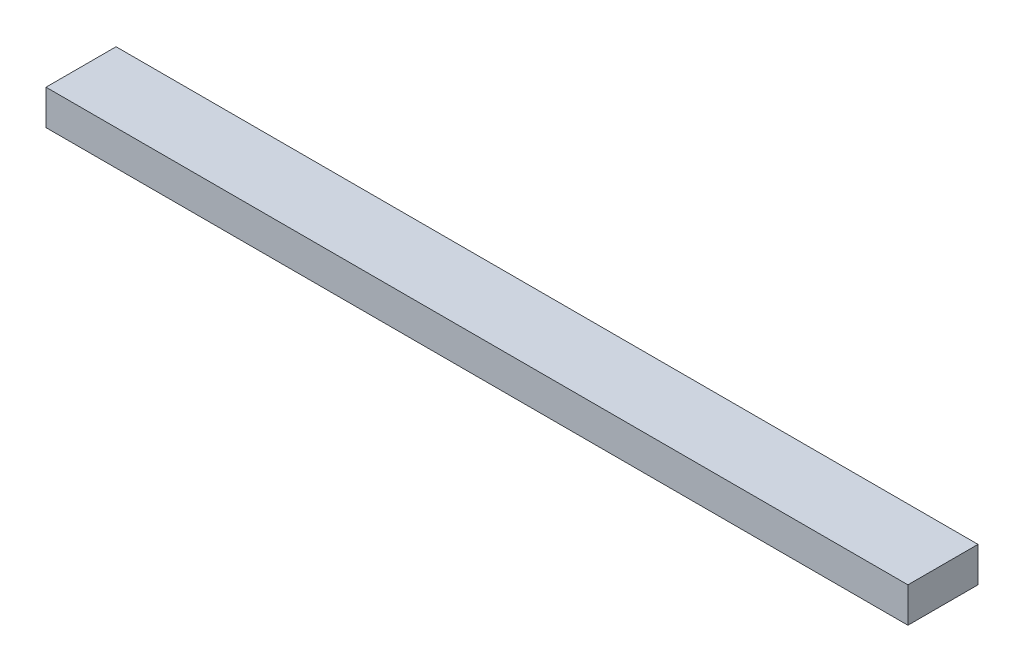
ISO-10303-21;
HEADER;
FILE_DESCRIPTION(('STEP AP214'),'2;1');
FILE_NAME('part.step','',(''),(''),'','','');
FILE_SCHEMA(('AUTOMOTIVE_DESIGN { 1 0 10303 214 1 1 1 1 }'));
ENDSEC;
DATA;
#1=APPLICATION_CONTEXT('core data for automotive mechanical design processes');
#2=APPLICATION_PROTOCOL_DEFINITION('international standard','automotive_design',2000,#1);
#3=PRODUCT_CONTEXT('',#1,'mechanical');
#4=PRODUCT('Part','Part','',(#3));
#5=PRODUCT_RELATED_PRODUCT_CATEGORY('part','',(#4));
#6=PRODUCT_DEFINITION_FORMATION('','',#4);
#7=PRODUCT_DEFINITION_CONTEXT('part definition',#1,'design');
#8=PRODUCT_DEFINITION('design','',#6,#7);
#9=PRODUCT_DEFINITION_SHAPE('','',#8);
#10=(LENGTH_UNIT() NAMED_UNIT(*) SI_UNIT(.MILLI.,.METRE.));
#11=(NAMED_UNIT(*) PLANE_ANGLE_UNIT() SI_UNIT($,.RADIAN.));
#12=(NAMED_UNIT(*) SI_UNIT($,.STERADIAN.) SOLID_ANGLE_UNIT());
#13=UNCERTAINTY_MEASURE_WITH_UNIT(LENGTH_MEASURE(1.E-05),#10,'distance_accuracy_value','');
#14=(GEOMETRIC_REPRESENTATION_CONTEXT(3) GLOBAL_UNCERTAINTY_ASSIGNED_CONTEXT((#13)) GLOBAL_UNIT_ASSIGNED_CONTEXT((#10,
#11,#12)) REPRESENTATION_CONTEXT('',''));
#15=CARTESIAN_POINT('',(0.,0.,0.));
#16=DIRECTION('',(0.,0.,1.));
#17=DIRECTION('',(1.,0.,0.));
#18=AXIS2_PLACEMENT_3D('',#15,#16,#17);
#19=CARTESIAN_POINT('',(-123.,10.,-9.99999999999998));
#20=DIRECTION('',(1.,0.,0.));
#21=DIRECTION('',(0.,0.,-1.));
#22=AXIS2_PLACEMENT_3D('',#19,#20,#21);
#23=PLANE('',#22);
#24=DIRECTION('',(0.,0.,1.));
#25=VECTOR('',#24,1.);
#26=CARTESIAN_POINT('',(-123.,0.,-9.99999999999998));
#27=LINE('',#26,#25);
#28=CARTESIAN_POINT('',(-123.,0.,-9.99999999999998));
#29=VERTEX_POINT('',#28);
#30=CARTESIAN_POINT('',(-123.,0.,10.));
#31=VERTEX_POINT('',#30);
#32=EDGE_CURVE('E98',#29,#31,#27,.T.);
#33=ORIENTED_EDGE('',*,*,#32,.T.);
#34=DIRECTION('',(0.,-1.,0.));
#35=VECTOR('',#34,1.);
#36=CARTESIAN_POINT('',(-123.,10.,10.));
#37=LINE('',#36,#35);
#38=CARTESIAN_POINT('',(-123.,10.,10.));
#39=VERTEX_POINT('',#38);
#40=EDGE_CURVE('E11',#39,#31,#37,.T.);
#41=ORIENTED_EDGE('',*,*,#40,.F.);
#42=DIRECTION('',(0.,0.,1.));
#43=VECTOR('',#42,1.);
#44=CARTESIAN_POINT('',(-123.,10.,-9.99999999999998));
#45=LINE('',#44,#43);
#46=CARTESIAN_POINT('',(-123.,10.,-9.99999999999998));
#47=VERTEX_POINT('',#46);
#48=EDGE_CURVE('E86',#47,#39,#45,.T.);
#49=ORIENTED_EDGE('',*,*,#48,.F.);
#50=DIRECTION('',(0.,-1.,0.));
#51=VECTOR('',#50,1.);
#52=CARTESIAN_POINT('',(-123.,10.,-9.99999999999998));
#53=LINE('',#52,#51);
#54=EDGE_CURVE('E94',#47,#29,#53,.T.);
#55=ORIENTED_EDGE('',*,*,#54,.T.);
#56=EDGE_LOOP('',(#33,#41,#49,#55));
#57=FACE_BOUND('',#56,.T.);
#58=ADVANCED_FACE('F35',(#57),#23,.F.);
#59=CARTESIAN_POINT('',(123.,10.,9.99999999999999));
#60=DIRECTION('',(0.,0.,-1.));
#61=DIRECTION('',(-1.,0.,0.));
#62=AXIS2_PLACEMENT_3D('',#59,#60,#61);
#63=PLANE('',#62);
#64=DIRECTION('',(1.,0.,0.));
#65=VECTOR('',#64,1.);
#66=CARTESIAN_POINT('',(123.,0.,9.99999999999999));
#67=LINE('',#66,#65);
#68=CARTESIAN_POINT('',(123.,0.,9.99999999999999));
#69=VERTEX_POINT('',#68);
#70=EDGE_CURVE('E90',#31,#69,#67,.T.);
#71=ORIENTED_EDGE('',*,*,#70,.T.);
#72=DIRECTION('',(0.,-1.,0.));
#73=VECTOR('',#72,1.);
#74=CARTESIAN_POINT('',(123.,10.,9.99999999999999));
#75=LINE('',#74,#73);
#76=CARTESIAN_POINT('',(123.,10.,9.99999999999999));
#77=VERTEX_POINT('',#76);
#78=EDGE_CURVE('E43',#77,#69,#75,.T.);
#79=ORIENTED_EDGE('',*,*,#78,.F.);
#80=DIRECTION('',(1.,0.,0.));
#81=VECTOR('',#80,1.);
#82=CARTESIAN_POINT('',(123.,10.,9.99999999999999));
#83=LINE('',#82,#81);
#84=EDGE_CURVE('E81',#39,#77,#83,.T.);
#85=ORIENTED_EDGE('',*,*,#84,.F.);
#86=ORIENTED_EDGE('',*,*,#40,.T.);
#87=EDGE_LOOP('',(#71,#79,#85,#86));
#88=FACE_BOUND('',#87,.T.);
#89=ADVANCED_FACE('F89',(#88),#63,.F.);
#90=CARTESIAN_POINT('',(123.,10.,-10.));
#91=DIRECTION('',(-1.,0.,0.));
#92=DIRECTION('',(0.,0.,1.));
#93=AXIS2_PLACEMENT_3D('',#90,#91,#92);
#94=PLANE('',#93);
#95=DIRECTION('',(0.,0.,-1.));
#96=VECTOR('',#95,1.);
#97=CARTESIAN_POINT('',(123.,0.,-10.));
#98=LINE('',#97,#96);
#99=CARTESIAN_POINT('',(123.,0.,-10.));
#100=VERTEX_POINT('',#99);
#101=EDGE_CURVE('E68',#69,#100,#98,.T.);
#102=ORIENTED_EDGE('',*,*,#101,.T.);
#103=DIRECTION('',(0.,-1.,0.));
#104=VECTOR('',#103,1.);
#105=CARTESIAN_POINT('',(123.,10.,-10.));
#106=LINE('',#105,#104);
#107=CARTESIAN_POINT('',(123.,10.,-10.));
#108=VERTEX_POINT('',#107);
#109=EDGE_CURVE('E91',#108,#100,#106,.T.);
#110=ORIENTED_EDGE('',*,*,#109,.F.);
#111=DIRECTION('',(0.,0.,-1.));
#112=VECTOR('',#111,1.);
#113=CARTESIAN_POINT('',(123.,10.,-10.));
#114=LINE('',#113,#112);
#115=EDGE_CURVE('E84',#77,#108,#114,.T.);
#116=ORIENTED_EDGE('',*,*,#115,.F.);
#117=ORIENTED_EDGE('',*,*,#78,.T.);
#118=EDGE_LOOP('',(#102,#110,#116,#117));
#119=FACE_BOUND('',#118,.T.);
#120=ADVANCED_FACE('F92',(#119),#94,.F.);
#121=CARTESIAN_POINT('',(123.,10.,-10.));
#122=DIRECTION('',(0.,0.,1.));
#123=DIRECTION('',(1.,0.,0.));
#124=AXIS2_PLACEMENT_3D('',#121,#122,#123);
#125=PLANE('',#124);
#126=DIRECTION('',(-1.,0.,0.));
#127=VECTOR('',#126,1.);
#128=CARTESIAN_POINT('',(123.,0.,-10.));
#129=LINE('',#128,#127);
#130=EDGE_CURVE('E74',#100,#29,#129,.T.);
#131=ORIENTED_EDGE('',*,*,#130,.T.);
#132=ORIENTED_EDGE('',*,*,#54,.F.);
#133=DIRECTION('',(-1.,0.,0.));
#134=VECTOR('',#133,1.);
#135=CARTESIAN_POINT('',(123.,10.,-10.));
#136=LINE('',#135,#134);
#137=EDGE_CURVE('E51',#108,#47,#136,.T.);
#138=ORIENTED_EDGE('',*,*,#137,.F.);
#139=ORIENTED_EDGE('',*,*,#109,.T.);
#140=EDGE_LOOP('',(#131,#132,#138,#139));
#141=FACE_BOUND('',#140,.T.);
#142=ADVANCED_FACE('F105',(#141),#125,.F.);
#143=CARTESIAN_POINT('',(0.,10.,0.));
#144=DIRECTION('',(0.,-1.,0.));
#145=DIRECTION('',(0.,0.,-1.));
#146=AXIS2_PLACEMENT_3D('',#143,#144,#145);
#147=PLANE('',#146);
#148=ORIENTED_EDGE('',*,*,#48,.T.);
#149=ORIENTED_EDGE('',*,*,#84,.T.);
#150=ORIENTED_EDGE('',*,*,#115,.T.);
#151=ORIENTED_EDGE('',*,*,#137,.T.);
#152=EDGE_LOOP('',(#148,#149,#150,#151));
#153=FACE_BOUND('',#152,.T.);
#154=ADVANCED_FACE('F82',(#153),#147,.F.);
#155=CARTESIAN_POINT('',(0.,0.,0.));
#156=DIRECTION('',(0.,-1.,0.));
#157=DIRECTION('',(0.,0.,-1.));
#158=AXIS2_PLACEMENT_3D('',#155,#156,#157);
#159=PLANE('',#158);
#160=ORIENTED_EDGE('',*,*,#32,.F.);
#161=ORIENTED_EDGE('',*,*,#130,.F.);
#162=ORIENTED_EDGE('',*,*,#101,.F.);
#163=ORIENTED_EDGE('',*,*,#70,.F.);
#164=EDGE_LOOP('',(#160,#161,#162,#163));
#165=FACE_BOUND('',#164,.T.);
#166=ADVANCED_FACE('F108',(#165),#159,.T.);
#167=CLOSED_SHELL('',(#58,#89,#120,#142,#154,#166));
#168=MANIFOLD_SOLID_BREP('B2',#167);
#169=ADVANCED_BREP_SHAPE_REPRESENTATION('',(#18,#168),#14);
#170=SHAPE_DEFINITION_REPRESENTATION(#9,#169);
ENDSEC;
END-ISO-10303-21;
